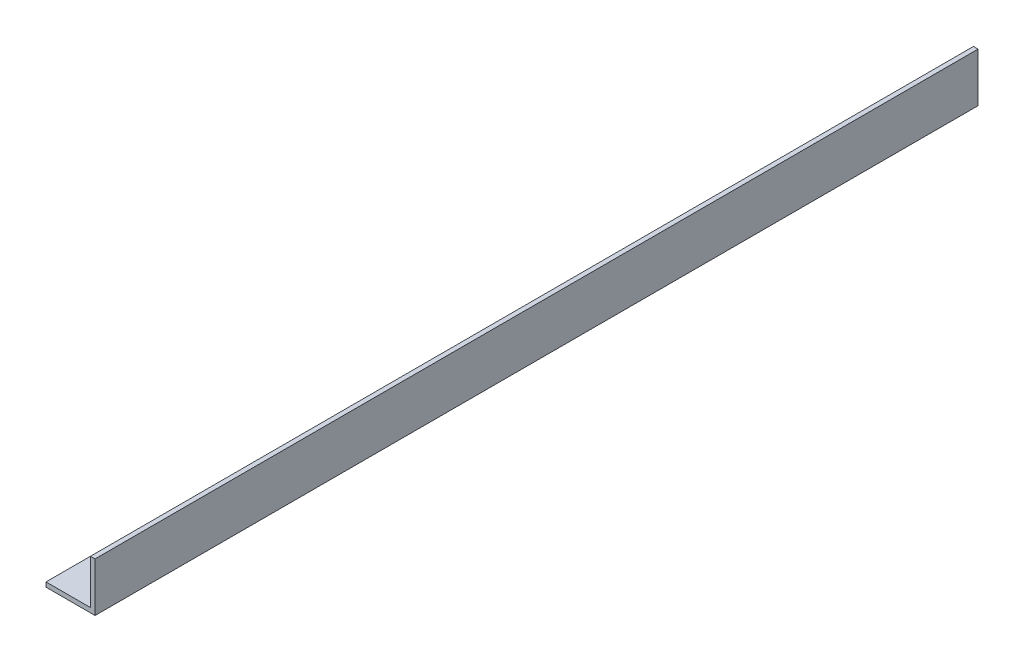
ISO-10303-21;
HEADER;
FILE_DESCRIPTION(('STEP AP214'),'2;1');
FILE_NAME('part.step','',(''),(''),'','','');
FILE_SCHEMA(('AUTOMOTIVE_DESIGN { 1 0 10303 214 1 1 1 1 }'));
ENDSEC;
DATA;
#1=APPLICATION_CONTEXT('core data for automotive mechanical design processes');
#2=APPLICATION_PROTOCOL_DEFINITION('international standard','automotive_design',2000,#1);
#3=PRODUCT_CONTEXT('',#1,'mechanical');
#4=PRODUCT('Part','Part','',(#3));
#5=PRODUCT_RELATED_PRODUCT_CATEGORY('part','',(#4));
#6=PRODUCT_DEFINITION_FORMATION('','',#4);
#7=PRODUCT_DEFINITION_CONTEXT('part definition',#1,'design');
#8=PRODUCT_DEFINITION('design','',#6,#7);
#9=PRODUCT_DEFINITION_SHAPE('','',#8);
#10=(LENGTH_UNIT() NAMED_UNIT(*) SI_UNIT(.MILLI.,.METRE.));
#11=(NAMED_UNIT(*) PLANE_ANGLE_UNIT() SI_UNIT($,.RADIAN.));
#12=(NAMED_UNIT(*) SI_UNIT($,.STERADIAN.) SOLID_ANGLE_UNIT());
#13=UNCERTAINTY_MEASURE_WITH_UNIT(LENGTH_MEASURE(1.E-05),#10,'distance_accuracy_value','');
#14=(GEOMETRIC_REPRESENTATION_CONTEXT(3) GLOBAL_UNCERTAINTY_ASSIGNED_CONTEXT((#13)) GLOBAL_UNIT_ASSIGNED_CONTEXT((#10,
#11,#12)) REPRESENTATION_CONTEXT('',''));
#15=CARTESIAN_POINT('',(0.,0.,0.));
#16=DIRECTION('',(0.,0.,1.));
#17=DIRECTION('',(1.,0.,0.));
#18=AXIS2_PLACEMENT_3D('',#15,#16,#17);
#19=CARTESIAN_POINT('',(-12.7,0.,114.3));
#20=DIRECTION('',(1.,0.,0.));
#21=DIRECTION('',(0.,0.,-1.));
#22=AXIS2_PLACEMENT_3D('',#19,#20,#21);
#23=PLANE('',#22);
#24=DIRECTION('',(0.,0.,-1.));
#25=VECTOR('',#24,1.);
#26=CARTESIAN_POINT('',(-12.7,1.190625,114.3));
#27=LINE('',#26,#25);
#28=CARTESIAN_POINT('',(-12.7,1.190625,114.3));
#29=VERTEX_POINT('',#28);
#30=CARTESIAN_POINT('',(-12.7,1.190625,-114.3));
#31=VERTEX_POINT('',#30);
#32=EDGE_CURVE('E103',#29,#31,#27,.T.);
#33=ORIENTED_EDGE('',*,*,#32,.T.);
#34=DIRECTION('',(0.,-1.,0.));
#35=VECTOR('',#34,1.);
#36=CARTESIAN_POINT('',(-12.7,0.,-114.3));
#37=LINE('',#36,#35);
#38=CARTESIAN_POINT('',(-12.7,0.,-114.3));
#39=VERTEX_POINT('',#38);
#40=EDGE_CURVE('E97',#31,#39,#37,.T.);
#41=ORIENTED_EDGE('',*,*,#40,.T.);
#42=DIRECTION('',(0.,0.,-1.));
#43=VECTOR('',#42,1.);
#44=CARTESIAN_POINT('',(-12.7,0.,114.3));
#45=LINE('',#44,#43);
#46=CARTESIAN_POINT('',(-12.7,0.,114.3));
#47=VERTEX_POINT('',#46);
#48=EDGE_CURVE('E11',#47,#39,#45,.T.);
#49=ORIENTED_EDGE('',*,*,#48,.F.);
#50=DIRECTION('',(0.,-1.,0.));
#51=VECTOR('',#50,1.);
#52=CARTESIAN_POINT('',(-12.7,0.,114.3));
#53=LINE('',#52,#51);
#54=EDGE_CURVE('E115',#29,#47,#53,.T.);
#55=ORIENTED_EDGE('',*,*,#54,.F.);
#56=EDGE_LOOP('',(#33,#41,#49,#55));
#57=FACE_BOUND('',#56,.T.);
#58=ADVANCED_FACE('F33',(#57),#23,.F.);
#59=CARTESIAN_POINT('',(-12.7,0.,114.3));
#60=DIRECTION('',(0.,1.,0.));
#61=DIRECTION('',(0.,0.,1.));
#62=AXIS2_PLACEMENT_3D('',#59,#60,#61);
#63=PLANE('',#62);
#64=ORIENTED_EDGE('',*,*,#48,.T.);
#65=DIRECTION('',(1.,0.,0.));
#66=VECTOR('',#65,1.);
#67=CARTESIAN_POINT('',(-12.7,0.,-114.3));
#68=LINE('',#67,#66);
#69=CARTESIAN_POINT('',(0.,0.,-114.3));
#70=VERTEX_POINT('',#69);
#71=EDGE_CURVE('E87',#39,#70,#68,.T.);
#72=ORIENTED_EDGE('',*,*,#71,.T.);
#73=DIRECTION('',(0.,0.,-1.));
#74=VECTOR('',#73,1.);
#75=CARTESIAN_POINT('',(0.,0.,114.3));
#76=LINE('',#75,#74);
#77=CARTESIAN_POINT('',(0.,0.,114.3));
#78=VERTEX_POINT('',#77);
#79=EDGE_CURVE('E40',#78,#70,#76,.T.);
#80=ORIENTED_EDGE('',*,*,#79,.F.);
#81=DIRECTION('',(1.,0.,0.));
#82=VECTOR('',#81,1.);
#83=CARTESIAN_POINT('',(-12.7,0.,114.3));
#84=LINE('',#83,#82);
#85=EDGE_CURVE('E88',#47,#78,#84,.T.);
#86=ORIENTED_EDGE('',*,*,#85,.F.);
#87=EDGE_LOOP('',(#64,#72,#80,#86));
#88=FACE_BOUND('',#87,.T.);
#89=ADVANCED_FACE('F85',(#88),#63,.F.);
#90=CARTESIAN_POINT('',(0.,0.,114.3));
#91=DIRECTION('',(-1.,0.,0.));
#92=DIRECTION('',(0.,0.,1.));
#93=AXIS2_PLACEMENT_3D('',#90,#91,#92);
#94=PLANE('',#93);
#95=ORIENTED_EDGE('',*,*,#79,.T.);
#96=DIRECTION('',(0.,1.,0.));
#97=VECTOR('',#96,1.);
#98=CARTESIAN_POINT('',(0.,0.,-114.3));
#99=LINE('',#98,#97);
#100=CARTESIAN_POINT('',(0.,12.7,-114.3));
#101=VERTEX_POINT('',#100);
#102=EDGE_CURVE('E101',#70,#101,#99,.T.);
#103=ORIENTED_EDGE('',*,*,#102,.T.);
#104=DIRECTION('',(0.,0.,-1.));
#105=VECTOR('',#104,1.);
#106=CARTESIAN_POINT('',(0.,12.7,114.3));
#107=LINE('',#106,#105);
#108=CARTESIAN_POINT('',(0.,12.7,114.3));
#109=VERTEX_POINT('',#108);
#110=EDGE_CURVE('E129',#109,#101,#107,.T.);
#111=ORIENTED_EDGE('',*,*,#110,.F.);
#112=DIRECTION('',(0.,1.,0.));
#113=VECTOR('',#112,1.);
#114=CARTESIAN_POINT('',(0.,0.,114.3));
#115=LINE('',#114,#113);
#116=EDGE_CURVE('E118',#78,#109,#115,.T.);
#117=ORIENTED_EDGE('',*,*,#116,.F.);
#118=EDGE_LOOP('',(#95,#103,#111,#117));
#119=FACE_BOUND('',#118,.T.);
#120=ADVANCED_FACE('F132',(#119),#94,.F.);
#121=CARTESIAN_POINT('',(0.,12.7,114.3));
#122=DIRECTION('',(0.,-1.,0.));
#123=DIRECTION('',(0.,0.,-1.));
#124=AXIS2_PLACEMENT_3D('',#121,#122,#123);
#125=PLANE('',#124);
#126=ORIENTED_EDGE('',*,*,#110,.T.);
#127=DIRECTION('',(-1.,0.,0.));
#128=VECTOR('',#127,1.);
#129=CARTESIAN_POINT('',(0.,12.7,-114.3));
#130=LINE('',#129,#128);
#131=CARTESIAN_POINT('',(-1.190625,12.7,-114.3));
#132=VERTEX_POINT('',#131);
#133=EDGE_CURVE('E107',#101,#132,#130,.T.);
#134=ORIENTED_EDGE('',*,*,#133,.T.);
#135=DIRECTION('',(0.,0.,-1.));
#136=VECTOR('',#135,1.);
#137=CARTESIAN_POINT('',(-1.190625,12.7,114.3));
#138=LINE('',#137,#136);
#139=CARTESIAN_POINT('',(-1.190625,12.7,114.3));
#140=VERTEX_POINT('',#139);
#141=EDGE_CURVE('E127',#140,#132,#138,.T.);
#142=ORIENTED_EDGE('',*,*,#141,.F.);
#143=DIRECTION('',(-1.,0.,0.));
#144=VECTOR('',#143,1.);
#145=CARTESIAN_POINT('',(0.,12.7,114.3));
#146=LINE('',#145,#144);
#147=EDGE_CURVE('E120',#109,#140,#146,.T.);
#148=ORIENTED_EDGE('',*,*,#147,.F.);
#149=EDGE_LOOP('',(#126,#134,#142,#148));
#150=FACE_BOUND('',#149,.T.);
#151=ADVANCED_FACE('F138',(#150),#125,.F.);
#152=CARTESIAN_POINT('',(-1.190625,12.7,114.3));
#153=DIRECTION('',(1.,0.,0.));
#154=DIRECTION('',(0.,1.,0.));
#155=AXIS2_PLACEMENT_3D('',#152,#153,#154);
#156=PLANE('',#155);
#157=ORIENTED_EDGE('',*,*,#141,.T.);
#158=DIRECTION('',(0.,-1.,0.));
#159=VECTOR('',#158,1.);
#160=CARTESIAN_POINT('',(-1.190625,12.7,-114.3));
#161=LINE('',#160,#159);
#162=CARTESIAN_POINT('',(-1.190625,1.190625,-114.3));
#163=VERTEX_POINT('',#162);
#164=EDGE_CURVE('E110',#132,#163,#161,.T.);
#165=ORIENTED_EDGE('',*,*,#164,.T.);
#166=DIRECTION('',(0.,0.,-1.));
#167=VECTOR('',#166,1.);
#168=CARTESIAN_POINT('',(-1.190625,1.190625,114.3));
#169=LINE('',#168,#167);
#170=CARTESIAN_POINT('',(-1.190625,1.190625,114.3));
#171=VERTEX_POINT('',#170);
#172=EDGE_CURVE('E125',#171,#163,#169,.T.);
#173=ORIENTED_EDGE('',*,*,#172,.F.);
#174=DIRECTION('',(0.,-1.,0.));
#175=VECTOR('',#174,1.);
#176=CARTESIAN_POINT('',(-1.190625,12.7,114.3));
#177=LINE('',#176,#175);
#178=EDGE_CURVE('E52',#140,#171,#177,.T.);
#179=ORIENTED_EDGE('',*,*,#178,.F.);
#180=EDGE_LOOP('',(#157,#165,#173,#179));
#181=FACE_BOUND('',#180,.T.);
#182=ADVANCED_FACE('F141',(#181),#156,.F.);
#183=CARTESIAN_POINT('',(-1.190625,1.190625,114.3));
#184=DIRECTION('',(0.,-1.,0.));
#185=DIRECTION('',(1.,0.,0.));
#186=AXIS2_PLACEMENT_3D('',#183,#184,#185);
#187=PLANE('',#186);
#188=ORIENTED_EDGE('',*,*,#172,.T.);
#189=DIRECTION('',(-1.,0.,0.));
#190=VECTOR('',#189,1.);
#191=CARTESIAN_POINT('',(-1.190625,1.190625,-114.3));
#192=LINE('',#191,#190);
#193=EDGE_CURVE('E113',#163,#31,#192,.T.);
#194=ORIENTED_EDGE('',*,*,#193,.T.);
#195=ORIENTED_EDGE('',*,*,#32,.F.);
#196=DIRECTION('',(-1.,0.,0.));
#197=VECTOR('',#196,1.);
#198=CARTESIAN_POINT('',(-1.190625,1.190625,114.3));
#199=LINE('',#198,#197);
#200=EDGE_CURVE('E47',#171,#29,#199,.T.);
#201=ORIENTED_EDGE('',*,*,#200,.F.);
#202=EDGE_LOOP('',(#188,#194,#195,#201));
#203=FACE_BOUND('',#202,.T.);
#204=ADVANCED_FACE('F143',(#203),#187,.F.);
#205=CARTESIAN_POINT('',(0.,0.,114.3));
#206=DIRECTION('',(0.,0.,1.));
#207=DIRECTION('',(1.,0.,0.));
#208=AXIS2_PLACEMENT_3D('',#205,#206,#207);
#209=PLANE('',#208);
#210=ORIENTED_EDGE('',*,*,#54,.T.);
#211=ORIENTED_EDGE('',*,*,#85,.T.);
#212=ORIENTED_EDGE('',*,*,#116,.T.);
#213=ORIENTED_EDGE('',*,*,#147,.T.);
#214=ORIENTED_EDGE('',*,*,#178,.T.);
#215=ORIENTED_EDGE('',*,*,#200,.T.);
#216=EDGE_LOOP('',(#210,#211,#212,#213,#214,#215));
#217=FACE_BOUND('',#216,.T.);
#218=ADVANCED_FACE('F135',(#217),#209,.T.);
#219=CARTESIAN_POINT('',(0.,0.,-114.3));
#220=DIRECTION('',(0.,0.,1.));
#221=DIRECTION('',(1.,0.,0.));
#222=AXIS2_PLACEMENT_3D('',#219,#220,#221);
#223=PLANE('',#222);
#224=ORIENTED_EDGE('',*,*,#40,.F.);
#225=ORIENTED_EDGE('',*,*,#193,.F.);
#226=ORIENTED_EDGE('',*,*,#164,.F.);
#227=ORIENTED_EDGE('',*,*,#133,.F.);
#228=ORIENTED_EDGE('',*,*,#102,.F.);
#229=ORIENTED_EDGE('',*,*,#71,.F.);
#230=EDGE_LOOP('',(#224,#225,#226,#227,#228,#229));
#231=FACE_BOUND('',#230,.T.);
#232=ADVANCED_FACE('F95',(#231),#223,.F.);
#233=CLOSED_SHELL('',(#58,#89,#120,#151,#182,#204,#218,#232));
#234=MANIFOLD_SOLID_BREP('B2',#233);
#235=ADVANCED_BREP_SHAPE_REPRESENTATION('',(#18,#234),#14);
#236=SHAPE_DEFINITION_REPRESENTATION(#9,#235);
ENDSEC;
END-ISO-10303-21;
